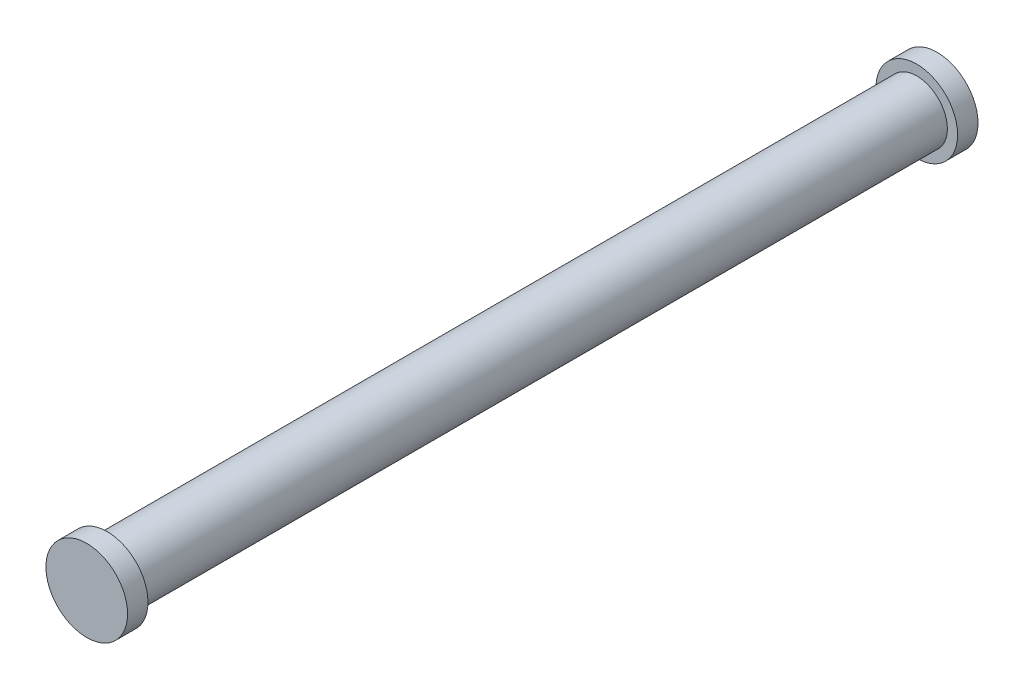
ISO-10303-21;
HEADER;
FILE_DESCRIPTION(('STEP AP214'),'2;1');
FILE_NAME('part.step','',(''),(''),'','','');
FILE_SCHEMA(('AUTOMOTIVE_DESIGN { 1 0 10303 214 1 1 1 1 }'));
ENDSEC;
DATA;
#1=APPLICATION_CONTEXT('core data for automotive mechanical design processes');
#2=APPLICATION_PROTOCOL_DEFINITION('international standard','automotive_design',2000,#1);
#3=PRODUCT_CONTEXT('',#1,'mechanical');
#4=PRODUCT('Part','Part','',(#3));
#5=PRODUCT_RELATED_PRODUCT_CATEGORY('part','',(#4));
#6=PRODUCT_DEFINITION_FORMATION('','',#4);
#7=PRODUCT_DEFINITION_CONTEXT('part definition',#1,'design');
#8=PRODUCT_DEFINITION('design','',#6,#7);
#9=PRODUCT_DEFINITION_SHAPE('','',#8);
#10=(LENGTH_UNIT() NAMED_UNIT(*) SI_UNIT(.MILLI.,.METRE.));
#11=(NAMED_UNIT(*) PLANE_ANGLE_UNIT() SI_UNIT($,.RADIAN.));
#12=(NAMED_UNIT(*) SI_UNIT($,.STERADIAN.) SOLID_ANGLE_UNIT());
#13=UNCERTAINTY_MEASURE_WITH_UNIT(LENGTH_MEASURE(1.E-05),#10,'distance_accuracy_value','');
#14=(GEOMETRIC_REPRESENTATION_CONTEXT(3) GLOBAL_UNCERTAINTY_ASSIGNED_CONTEXT((#13)) GLOBAL_UNIT_ASSIGNED_CONTEXT((#10,
#11,#12)) REPRESENTATION_CONTEXT('',''));
#15=CARTESIAN_POINT('',(0.,0.,0.));
#16=DIRECTION('',(0.,0.,1.));
#17=DIRECTION('',(1.,0.,0.));
#18=AXIS2_PLACEMENT_3D('',#15,#16,#17);
#19=CARTESIAN_POINT('',(0.,0.,198.335));
#20=DIRECTION('',(0.,0.,-1.));
#21=DIRECTION('',(-1.,0.,0.));
#22=AXIS2_PLACEMENT_3D('',#19,#20,#21);
#23=CYLINDRICAL_SURFACE('',#22,15.);
#24=CARTESIAN_POINT('',(0.,0.,198.335));
#25=DIRECTION('',(0.,0.,1.));
#26=DIRECTION('',(1.,0.,0.));
#27=AXIS2_PLACEMENT_3D('',#24,#25,#26);
#28=CIRCLE('',#27,15.);
#29=CARTESIAN_POINT('',(15.,0.,198.335));
#30=VERTEX_POINT('',#29);
#31=EDGE_CURVE('E10',#30,#30,#28,.T.);
#32=ORIENTED_EDGE('',*,*,#31,.F.);
#33=EDGE_LOOP('',(#32));
#34=FACE_BOUND('',#33,.T.);
#35=CARTESIAN_POINT('',(0.,0.,-198.335));
#36=DIRECTION('',(0.,0.,1.));
#37=DIRECTION('',(1.,0.,0.));
#38=AXIS2_PLACEMENT_3D('',#35,#36,#37);
#39=CIRCLE('',#38,15.);
#40=CARTESIAN_POINT('',(15.,0.,-198.335));
#41=VERTEX_POINT('',#40);
#42=EDGE_CURVE('E34',#41,#41,#39,.T.);
#43=ORIENTED_EDGE('',*,*,#42,.T.);
#44=EDGE_LOOP('',(#43));
#45=FACE_BOUND('',#44,.T.);
#46=ADVANCED_FACE('F31',(#34,#45),#23,.T.);
#47=CARTESIAN_POINT('',(0.,0.,208.335));
#48=DIRECTION('',(0.,0.,-1.));
#49=DIRECTION('',(-1.,0.,0.));
#50=AXIS2_PLACEMENT_3D('',#47,#48,#49);
#51=CYLINDRICAL_SURFACE('',#50,20.);
#52=CARTESIAN_POINT('',(0.,0.,208.335));
#53=DIRECTION('',(0.,0.,1.));
#54=DIRECTION('',(1.,0.,0.));
#55=AXIS2_PLACEMENT_3D('',#52,#53,#54);
#56=CIRCLE('',#55,20.);
#57=CARTESIAN_POINT('',(20.,0.,208.335));
#58=VERTEX_POINT('',#57);
#59=EDGE_CURVE('E38',#58,#58,#56,.T.);
#60=ORIENTED_EDGE('',*,*,#59,.F.);
#61=EDGE_LOOP('',(#60));
#62=FACE_BOUND('',#61,.T.);
#63=CARTESIAN_POINT('',(0.,0.,198.335));
#64=DIRECTION('',(0.,0.,1.));
#65=DIRECTION('',(1.,0.,0.));
#66=AXIS2_PLACEMENT_3D('',#63,#64,#65);
#67=CIRCLE('',#66,20.);
#68=CARTESIAN_POINT('',(20.,0.,198.335));
#69=VERTEX_POINT('',#68);
#70=EDGE_CURVE('E42',#69,#69,#67,.T.);
#71=ORIENTED_EDGE('',*,*,#70,.T.);
#72=EDGE_LOOP('',(#71));
#73=FACE_BOUND('',#72,.T.);
#74=ADVANCED_FACE('F79',(#62,#73),#51,.T.);
#75=CARTESIAN_POINT('',(0.,0.,208.335));
#76=DIRECTION('',(0.,0.,1.));
#77=DIRECTION('',(1.,0.,0.));
#78=AXIS2_PLACEMENT_3D('',#75,#76,#77);
#79=PLANE('',#78);
#80=ORIENTED_EDGE('',*,*,#59,.T.);
#81=EDGE_LOOP('',(#80));
#82=FACE_BOUND('',#81,.T.);
#83=ADVANCED_FACE('F75',(#82),#79,.T.);
#84=CARTESIAN_POINT('',(0.,0.,198.335));
#85=DIRECTION('',(0.,0.,1.));
#86=DIRECTION('',(1.,0.,0.));
#87=AXIS2_PLACEMENT_3D('',#84,#85,#86);
#88=PLANE('',#87);
#89=ORIENTED_EDGE('',*,*,#31,.T.);
#90=EDGE_LOOP('',(#89));
#91=FACE_BOUND('',#90,.T.);
#92=ORIENTED_EDGE('',*,*,#70,.F.);
#93=EDGE_LOOP('',(#92));
#94=FACE_BOUND('',#93,.T.);
#95=ADVANCED_FACE('F67',(#91,#94),#88,.F.);
#96=CARTESIAN_POINT('',(0.,0.,-208.335));
#97=DIRECTION('',(0.,0.,1.));
#98=DIRECTION('',(1.,0.,0.));
#99=AXIS2_PLACEMENT_3D('',#96,#97,#98);
#100=CYLINDRICAL_SURFACE('',#99,20.);
#101=CARTESIAN_POINT('',(0.,0.,-208.335));
#102=DIRECTION('',(0.,0.,1.));
#103=DIRECTION('',(1.,0.,0.));
#104=AXIS2_PLACEMENT_3D('',#101,#102,#103);
#105=CIRCLE('',#104,20.);
#106=CARTESIAN_POINT('',(20.,0.,-208.335));
#107=VERTEX_POINT('',#106);
#108=EDGE_CURVE('E50',#107,#107,#105,.T.);
#109=ORIENTED_EDGE('',*,*,#108,.T.);
#110=EDGE_LOOP('',(#109));
#111=FACE_BOUND('',#110,.T.);
#112=CARTESIAN_POINT('',(0.,0.,-198.335));
#113=DIRECTION('',(0.,0.,1.));
#114=DIRECTION('',(1.,0.,0.));
#115=AXIS2_PLACEMENT_3D('',#112,#113,#114);
#116=CIRCLE('',#115,20.);
#117=CARTESIAN_POINT('',(20.,0.,-198.335));
#118=VERTEX_POINT('',#117);
#119=EDGE_CURVE('E47',#118,#118,#116,.T.);
#120=ORIENTED_EDGE('',*,*,#119,.F.);
#121=EDGE_LOOP('',(#120));
#122=FACE_BOUND('',#121,.T.);
#123=ADVANCED_FACE('F65',(#111,#122),#100,.T.);
#124=CARTESIAN_POINT('',(0.,0.,-208.335));
#125=DIRECTION('',(0.,0.,-1.));
#126=DIRECTION('',(1.,0.,0.));
#127=AXIS2_PLACEMENT_3D('',#124,#125,#126);
#128=PLANE('',#127);
#129=ORIENTED_EDGE('',*,*,#108,.F.);
#130=EDGE_LOOP('',(#129));
#131=FACE_BOUND('',#130,.T.);
#132=ADVANCED_FACE('F61',(#131),#128,.T.);
#133=CARTESIAN_POINT('',(0.,0.,-198.335));
#134=DIRECTION('',(0.,0.,-1.));
#135=DIRECTION('',(1.,0.,0.));
#136=AXIS2_PLACEMENT_3D('',#133,#134,#135);
#137=PLANE('',#136);
#138=ORIENTED_EDGE('',*,*,#42,.F.);
#139=EDGE_LOOP('',(#138));
#140=FACE_BOUND('',#139,.T.);
#141=ORIENTED_EDGE('',*,*,#119,.T.);
#142=EDGE_LOOP('',(#141));
#143=FACE_BOUND('',#142,.T.);
#144=ADVANCED_FACE('F58',(#140,#143),#137,.F.);
#145=CLOSED_SHELL('',(#46,#74,#83,#95,#123,#132,#144));
#146=MANIFOLD_SOLID_BREP('B2',#145);
#147=ADVANCED_BREP_SHAPE_REPRESENTATION('',(#18,#146),#14);
#148=SHAPE_DEFINITION_REPRESENTATION(#9,#147);
ENDSEC;
END-ISO-10303-21;
